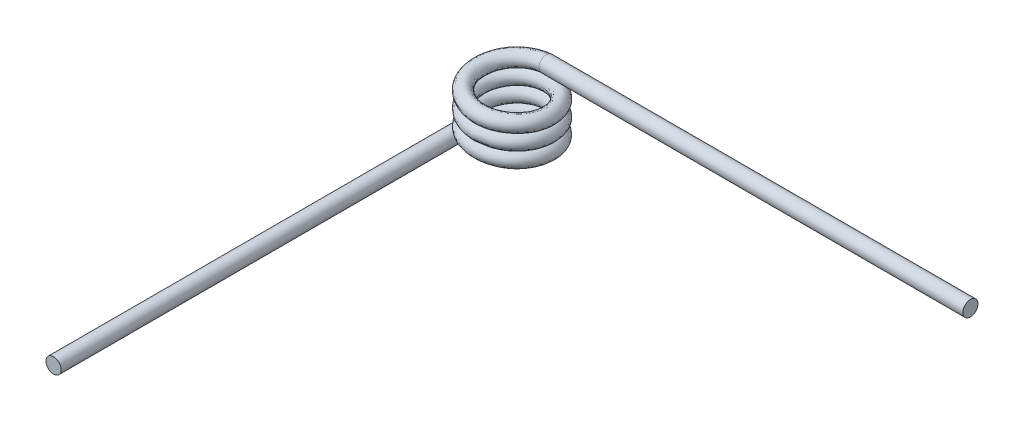
ISO-10303-21;
HEADER;
FILE_DESCRIPTION(('STEP AP214'),'2;1');
FILE_NAME('part.step','',(''),(''),'','','');
FILE_SCHEMA(('AUTOMOTIVE_DESIGN { 1 0 10303 214 1 1 1 1 }'));
ENDSEC;
DATA;
#1=APPLICATION_CONTEXT('core data for automotive mechanical design processes');
#2=APPLICATION_PROTOCOL_DEFINITION('international standard','automotive_design',2000,#1);
#3=PRODUCT_CONTEXT('',#1,'mechanical');
#4=PRODUCT('Part','Part','',(#3));
#5=PRODUCT_RELATED_PRODUCT_CATEGORY('part','',(#4));
#6=PRODUCT_DEFINITION_FORMATION('','',#4);
#7=PRODUCT_DEFINITION_CONTEXT('part definition',#1,'design');
#8=PRODUCT_DEFINITION('design','',#6,#7);
#9=PRODUCT_DEFINITION_SHAPE('','',#8);
#10=(LENGTH_UNIT() NAMED_UNIT(*) SI_UNIT(.MILLI.,.METRE.));
#11=(NAMED_UNIT(*) PLANE_ANGLE_UNIT() SI_UNIT($,.RADIAN.));
#12=(NAMED_UNIT(*) SI_UNIT($,.STERADIAN.) SOLID_ANGLE_UNIT());
#13=UNCERTAINTY_MEASURE_WITH_UNIT(LENGTH_MEASURE(1.E-05),#10,'distance_accuracy_value','');
#14=(GEOMETRIC_REPRESENTATION_CONTEXT(3) GLOBAL_UNCERTAINTY_ASSIGNED_CONTEXT((#13)) GLOBAL_UNIT_ASSIGNED_CONTEXT((#10,
#11,#12)) REPRESENTATION_CONTEXT('',''));
#15=CARTESIAN_POINT('',(0.,0.,0.));
#16=DIRECTION('',(0.,0.,1.));
#17=DIRECTION('',(1.,0.,0.));
#18=AXIS2_PLACEMENT_3D('',#15,#16,#17);
#19=CARTESIAN_POINT('',(50.,5.85,-4.09999999999983));
#20=DIRECTION('',(-1.,0.,0.));
#21=DIRECTION('',(0.,0.,1.));
#22=AXIS2_PLACEMENT_3D('',#19,#20,#21);
#23=PLANE('',#22);
#24=CARTESIAN_POINT('',(50.,5.85,-4.09999999999983));
#25=DIRECTION('',(-1.,0.,0.));
#26=DIRECTION('',(0.,0.,1.));
#27=AXIS2_PLACEMENT_3D('',#24,#25,#26);
#28=CIRCLE('',#27,0.895);
#29=CARTESIAN_POINT('',(50.,5.85,-3.20499999999983));
#30=VERTEX_POINT('',#29);
#31=EDGE_CURVE('E74',#30,#30,#28,.T.);
#32=ORIENTED_EDGE('',*,*,#31,.F.);
#33=EDGE_LOOP('',(#32));
#34=FACE_BOUND('',#33,.T.);
#35=ADVANCED_FACE('F59',(#34),#23,.F.);
#36=CARTESIAN_POINT('',(-4.09999999999998,0.,50.));
#37=DIRECTION('',(0.,0.,1.));
#38=DIRECTION('',(0.999999984999263,0.000173209334708053,0.));
#39=AXIS2_PLACEMENT_3D('',#36,#37,#38);
#40=PLANE('',#39);
#41=CARTESIAN_POINT('',(-4.09999999999998,0.,50.));
#42=DIRECTION('',(0.,0.,1.));
#43=DIRECTION('',(0.999999984999263,0.000173209334708053,0.));
#44=AXIS2_PLACEMENT_3D('',#41,#42,#43);
#45=CIRCLE('',#44,0.895);
#46=CARTESIAN_POINT('',(-3.20500001342564,0.00015502235456631,50.));
#47=VERTEX_POINT('',#46);
#48=EDGE_CURVE('E68',#47,#47,#45,.T.);
#49=ORIENTED_EDGE('',*,*,#48,.T.);
#50=EDGE_LOOP('',(#49));
#51=FACE_BOUND('',#50,.T.);
#52=ADVANCED_FACE('F150',(#51),#40,.T.);
#53=CARTESIAN_POINT('',(1.31838984174237E-13,5.85,-4.1));
#54=DIRECTION('',(1.,0.,0.));
#55=DIRECTION('',(0.,0.,-1.));
#56=AXIS2_PLACEMENT_3D('',#53,#54,#55);
#57=CYLINDRICAL_SURFACE('',#56,0.895);
#58=ORIENTED_EDGE('',*,*,#31,.T.);
#59=EDGE_LOOP('',(#58));
#60=FACE_BOUND('',#59,.T.);
#61=CARTESIAN_POINT('',(1.31838984174237E-13,5.85,-4.1));
#62=DIRECTION('',(-0.997567791117822,-0.0697029563527303,0.));
#63=DIRECTION('',(0.,0.,1.));
#64=AXIS2_PLACEMENT_3D('',#61,#62,#63);
#65=CIRCLE('',#64,0.895);
#66=CARTESIAN_POINT('',(1.12795573631392E-13,5.85,-3.205));
#67=VERTEX_POINT('',#66);
#68=EDGE_CURVE('E62',#67,#67,#65,.T.);
#69=ORIENTED_EDGE('',*,*,#68,.F.);
#70=EDGE_LOOP('',(#69));
#71=FACE_BOUND('',#70,.T.);
#72=ADVANCED_FACE('F112',(#60,#71),#57,.T.);
#73=CARTESIAN_POINT('',(-3.20500001342565,0.000154645307818939,1.08055164468879E-05));
#74=CARTESIAN_POINT('',(-3.2050013299972,0.0383816007414158,-0.429189029505993));
#75=CARTESIAN_POINT('',(-3.11621796892935,0.0771385992123076,-0.859326699102032));
#76=CARTESIAN_POINT('',(-2.45243955935918,0.228419514681997,-2.43070850785631));
#77=CARTESIAN_POINT('',(-1.18164623743942,0.344924435274742,-3.24288729839574));
#78=CARTESIAN_POINT('',(1.37560178644054,0.572610691536532,-3.16417848126939));
#79=CARTESIAN_POINT('',(2.59908753937639,0.689622922267981,-2.26746000231663));
#80=CARTESIAN_POINT('',(3.38450432639152,0.899813904964377,-0.0389316529655378));
#81=CARTESIAN_POINT('',(3.17319911975832,0.998664578495864,1.18478394792553));
#82=CARTESIAN_POINT('',(1.61077343776416,1.2193731730278,3.08927138594743));
#83=CARTESIAN_POINT('',(0.0336030657551545,1.34066765999369,3.48204795871798));
#84=CARTESIAN_POINT('',(-2.48737425252371,1.58467708717419,2.43935441755975));
#85=CARTESIAN_POINT('',(-3.322439560533,1.70707492561746,1.03900660883233));
#86=CARTESIAN_POINT('',(-3.06183280560357,1.94467420520004,-1.61465694780401));
#87=CARTESIAN_POINT('',(-2.04402537359597,2.06370448888653,-2.79072118364711));
#88=CARTESIAN_POINT('',(0.454572081571415,2.29289283740052,-3.41914635713131));
#89=CARTESIAN_POINT('',(1.88054140060302,2.41038565352774,-2.89060667753968));
#90=CARTESIAN_POINT('',(3.35125471925957,2.6368247590209,-0.812960447732239));
#91=CARTESIAN_POINT('',(3.37502074409755,2.75446140942662,0.708966098216149));
#92=CARTESIAN_POINT('',(1.96832642065917,2.9809954214511,2.83175997687712));
#93=CARTESIAN_POINT('',(0.560300389829423,3.09837870307389,3.4037317767149));
#94=CARTESIAN_POINT('',(-1.93173717038222,3.32531776364883,2.85783840746567));
#95=CARTESIAN_POINT('',(-2.97104302840074,3.44223051348647,1.75499005185013));
#96=CARTESIAN_POINT('',(-3.36311468203757,3.66969967839537,-0.771859289282536));
#97=CARTESIAN_POINT('',(-2.71219328746953,3.78609667668421,-2.1350278426114));
#98=CARTESIAN_POINT('',(-0.49269288598277,4.01407062177147,-3.41626071029161));
#99=CARTESIAN_POINT('',(1.00925609570965,4.13000516148698,-3.30176921345476));
#100=CARTESIAN_POINT('',(3.00943699413217,4.35839846983283,-1.69204754801851));
#101=CARTESIAN_POINT('',(3.44385294100598,4.47397850478147,-0.253189967894031));
#102=CARTESIAN_POINT('',(2.66448149747458,4.70265467495869,2.19647338701847));
#103=CARTESIAN_POINT('',(1.48063915010857,4.81805237315276,3.11975744358879));
#104=CARTESIAN_POINT('',(-1.0860007615064,5.04680580428563,3.27808286597758));
#105=CARTESIAN_POINT('',(-2.37453223483457,5.16225905365727,2.50687897809769));
#106=CARTESIAN_POINT('',(-3.44929881928071,5.39097281853296,0.171010940190842));
#107=CARTESIAN_POINT('',(-3.19026859059207,5.50673521976878,-1.31324440463397));
#108=CARTESIAN_POINT('',(-1.71006202555596,5.69621065459718,-2.8408914428862));
#109=CARTESIAN_POINT('',(-0.864108123636782,5.77303766190829,-3.20499855663933));
#110=CARTESIAN_POINT('',(1.07552855510562E-13,5.85,-3.205));
#111=CARTESIAN_POINT('',(-3.20508118294069,0.467635758530262,0.0326750674551346));
#112=CARTESIAN_POINT('',(-3.209385163449,0.50586145164813,-0.39652019976706));
#113=CARTESIAN_POINT('',(-3.12511629615128,0.544618732220028,-0.827609276396845));
#114=CARTESIAN_POINT('',(-2.47675118719805,0.69590068197791,-2.40552581988831));
#115=CARTESIAN_POINT('',(-1.21470696330118,0.812405499347613,-3.23116270038948));
#116=CARTESIAN_POINT('',(1.34335983245034,1.0400913620739,-3.17798224951149));
#117=CARTESIAN_POINT('',(2.57628559744716,1.15710365428988,-2.29407978511829));
#118=CARTESIAN_POINT('',(3.38391277510455,1.36729473519533,-0.0733468933562186));
#119=CARTESIAN_POINT('',(3.18522709353604,1.46614622707909,1.15238591074265));
#120=CARTESIAN_POINT('',(1.64240489399777,1.68685389120813,3.07299605480319));
#121=CARTESIAN_POINT('',(0.0690983362146306,1.80815018750543,3.48173995441145));
#122=CARTESIAN_POINT('',(-2.46256828416014,2.05215664156883,2.46479951116549));
#123=CARTESIAN_POINT('',(-3.31211080521433,2.17455648932132,1.07286434010239));
#124=CARTESIAN_POINT('',(-3.07814848353979,2.41215429136843,-1.58345036589963));
#125=CARTESIAN_POINT('',(-2.07257100089001,2.53118523066888,-2.77021266916508));
#126=CARTESIAN_POINT('',(0.41979803207613,2.76037367036715,-3.42353808980824));
#127=CARTESIAN_POINT('',(1.85134039132263,2.87786639604855,-2.90998180810748));
#128=CARTESIAN_POINT('',(3.34277111969176,3.10430559219509,-0.846960681285954));
#129=CARTESIAN_POINT('',(3.38253511677856,3.22194215126531,0.674735061786532));
#130=CARTESIAN_POINT('',(1.99697087948642,3.4484762553119,2.81157044612987));
#131=CARTESIAN_POINT('',(0.594939503367396,3.56585944402734,3.39835118225756));
#132=CARTESIAN_POINT('',(-1.90256864446002,3.79279859839674,2.8772776066313));
#133=CARTESIAN_POINT('',(-2.953483213921,3.90971125378712,1.78534203555492));
#134=CARTESIAN_POINT('',(-3.37073360333336,4.13718051379547,-0.737633894115676));
#135=CARTESIAN_POINT('',(-2.73413829878706,4.25357741683089,-2.10766498124113));
#136=CARTESIAN_POINT('',(-0.527373523544008,4.48155145732632,-3.41102610081762));
#137=CARTESIAN_POINT('',(0.975798940463027,4.59748590193276,-3.31232940981083));
#138=CARTESIAN_POINT('',(2.99204244235549,4.82587930508903,-1.7225137225697));
#139=CARTESIAN_POINT('',(3.44159843242577,4.94145924612306,-0.288207209889266));
#140=CARTESIAN_POINT('',(2.68662159118871,5.17013550929634,2.16925219418923));
#141=CARTESIAN_POINT('',(1.51247654556927,5.28553311389776,3.10500042821253));
#142=CARTESIAN_POINT('',(-1.05261914492358,5.51428664083588,3.28889821745873));
#143=CARTESIAN_POINT('',(-2.34928619730383,5.62973985803506,2.53124283296671));
#144=CARTESIAN_POINT('',(-3.44732865130242,5.85845353054291,0.206047830751971));
#145=CARTESIAN_POINT('',(-3.20380871589026,5.97421546035903,-1.28085890389312));
#146=CARTESIAN_POINT('',(-1.73890567232911,6.1636923833992,-2.82337217634719));
#147=CARTESIAN_POINT('',(-0.896926756789582,6.24050524928003,-3.19633600219198));
#148=CARTESIAN_POINT('',(-0.0326642624285667,6.31748112023501,-3.205));
#149=CARTESIAN_POINT('',(-3.63153412522373,0.892904131751271,0.0623898027550876));
#150=CARTESIAN_POINT('',(-3.63974965486505,0.931320754815126,-0.425729451743245));
#151=CARTESIAN_POINT('',(-3.54837528343568,0.969718996339793,-0.911664488432049));
#152=CARTESIAN_POINT('',(-2.82391099329299,1.12192048361994,-2.70887626750492));
#153=CARTESIAN_POINT('',(-1.4048586983605,1.23725561079709,-3.65200433027286));
#154=CARTESIAN_POINT('',(1.49993515739105,1.46583419222778,-3.61139906964164));
#155=CARTESIAN_POINT('',(2.90033466372411,1.58193433780461,-2.62272476417291));
#156=CARTESIAN_POINT('',(3.8344687862607,1.79300503787936,-0.107467631307042));
#157=CARTESIAN_POINT('',(3.61763713209895,1.8916342839015,1.28141877538018));
#158=CARTESIAN_POINT('',(1.88651556061936,2.11189824057867,3.46795773284622));
#159=CARTESIAN_POINT('',(0.105762792600349,2.23347364836279,3.9446805180003));
#160=CARTESIAN_POINT('',(-2.77030898463452,2.47735290409048,2.81273929447469));
#161=CARTESIAN_POINT('',(-3.74493578059228,2.59950639288652,1.24408983265405));
#162=CARTESIAN_POINT('',(-3.50014749856589,2.83775225198073,-1.77168215969839));
#163=CARTESIAN_POINT('',(-2.3733812161966,2.95600637144514,-3.12208763288304));
#164=CARTESIAN_POINT('',(0.451488872102087,3.18615240951107,-3.88311913823876));
#165=CARTESIAN_POINT('',(2.07325677949654,3.30269824906851,-3.31455899017708));
#166=CARTESIAN_POINT('',(3.78258592764624,3.5300835540239,-0.98364853041262));
#167=CARTESIAN_POINT('',(3.83999202393256,3.64677383926392,0.73546201115712));
#168=CARTESIAN_POINT('',(2.28326505746291,3.87425442864057,3.17237671454517));
#169=CARTESIAN_POINT('',(0.703867173014298,3.99069032054049,3.8469033252635));
#170=CARTESIAN_POINT('',(-2.13589700012175,4.2185776013483,3.27452707626169));
#171=CARTESIAN_POINT('',(-3.33231028753508,4.3345410456852,2.0493457227285));
#172=CARTESIAN_POINT('',(-3.82553123188503,4.56296059480471,-0.81209664798876));
#173=CARTESIAN_POINT('',(-3.1174812327495,4.67840616156725,-2.36532829997638));
#174=CARTESIAN_POINT('',(-0.621909926501579,4.90733259306863,-3.8622261226911));
#175=CARTESIAN_POINT('',(1.07732087697,5.02231375463375,-3.76304623356736));
#176=CARTESIAN_POINT('',(3.37888725535226,5.25166133721885,-1.9734761753806));
#177=CARTESIAN_POINT('',(3.89860147231572,5.36628646203412,-0.356573558952148));
#178=CARTESIAN_POINT('',(3.06033550703156,5.59591815175093,2.43952266599124));
#179=CARTESIAN_POINT('',(1.74137954770347,5.71036037475177,3.50643126480831));
#180=CARTESIAN_POINT('',(-1.16968758528683,5.94006937777568,3.73502193920987));
#181=CARTESIAN_POINT('',(-2.6409716675378,6.05455841462305,2.88961626577972));
#182=CARTESIAN_POINT('',(-3.90566514830589,6.28423921779579,0.2579579394151));
#183=CARTESIAN_POINT('',(-3.64239277248086,6.39918772804201,-1.42419709232077));
#184=CARTESIAN_POINT('',(-1.99163387395414,6.58926638210995,-3.18641868227861));
#185=CARTESIAN_POINT('',(-1.04232496750708,6.66569567712396,-3.61488719065627));
#186=CARTESIAN_POINT('',(-0.0623841459355748,6.74282317305046,-3.63137909583952));
#187=CARTESIAN_POINT('',(-4.56877591948537,0.892742187563623,0.0623784872447741));
#188=CARTESIAN_POINT('',(-4.57698645864984,0.931588191410899,-0.555276356532607));
#189=CARTESIAN_POINT('',(-4.46096199558103,0.969189484900535,-1.15986462767263));
#190=CARTESIAN_POINT('',(-3.53839429611191,1.12341017767838,-3.42604901006823));
#191=CARTESIAN_POINT('',(-1.75671776622997,1.23617436612145,-4.60052319798879));
#192=CARTESIAN_POINT('',(1.9085938668991,1.46671605714304,-4.53650325898639));
#193=CARTESIAN_POINT('',(3.65824441769773,1.58081105187784,-3.29189353770318));
#194=CARTESIAN_POINT('',(4.82603799070356,1.7938150834018,-0.113639378469413));
#195=CARTESIAN_POINT('',(4.54407986150676,1.89195416474994,1.62984741185049));
#196=CARTESIAN_POINT('',(2.35984256272712,2.11124465023328,4.36869025715536));
#197=CARTESIAN_POINT('',(0.115365934031153,2.23342996604051,4.96290563361561));
#198=CARTESIAN_POINT('',(-3.49637868729715,2.47703556800432,3.52667016645441));
#199=CARTESIAN_POINT('',(-4.7170040582404,2.59864350620321,1.55275232071589));
#200=CARTESIAN_POINT('',(-4.39512991131327,2.83831684179556,-2.24785553953706));
#201=CARTESIAN_POINT('',(-2.97751353685964,2.95486208971451,-3.93657580645617));
#202=CARTESIAN_POINT('',(0.590697938318274,3.18711288260974,-4.88456008844739));
#203=CARTESIAN_POINT('',(2.61946253649889,3.30157751288672,-4.16512683455915));
#204=CARTESIAN_POINT('',(4.7663285385226,3.53104231806558,-1.21610736847518));
#205=CARTESIAN_POINT('',(4.8305185299199,3.64565274170817,0.937410543351328));
#206=CARTESIAN_POINT('',(2.85529140338397,3.87521365621359,4.0058591968373));
#207=CARTESIAN_POINT('',(0.874027434042758,3.9895674409825,4.843645829254));
#208=CARTESIAN_POINT('',(-2.70712291569776,4.2195386507885,4.10885943076595));
#209=CARTESIAN_POINT('',(-4.20014562648092,4.33341578330097,2.56895935434275));
#210=CARTESIAN_POINT('',(-4.810003168602,4.56392401265826,-1.04422714676765));
#211=CARTESIAN_POINT('',(-3.91623342250622,4.67727859768189,-2.98643459143352));
#212=CARTESIAN_POINT('',(-0.760353091425209,4.90829832906471,-4.86449707052414));
#213=CARTESIAN_POINT('',(1.36739482234989,5.02118422933347,-4.73266543165534));
#214=CARTESIAN_POINT('',(4.26401619877042,5.25262904419554,-2.46419494001424));
#215=CARTESIAN_POINT('',(4.90766807612492,5.36515553518513,-0.436818019818215));
#216=CARTESIAN_POINT('',(3.83753158262272,5.59688720214761,3.08805793332902));
#217=CARTESIAN_POINT('',(2.18086606497502,5.70922954789484,4.41834728683702));
#218=CARTESIAN_POINT('',(-1.49378387678572,5.94103863143122,4.69403453651333));
#219=CARTESIAN_POINT('',(-3.33262983224151,6.05340832728146,3.62864425867248));
#220=CARTESIAN_POINT('',(-4.91709419902607,6.28521520574521,0.301989949552291));
#221=CARTESIAN_POINT('',(-4.57938256731222,6.39837664709376,-1.80404578928289));
#222=CARTESIAN_POINT('',(-2.4894790608199,6.58977501499452,-4.01948499637931));
#223=CARTESIAN_POINT('',(-1.29626757767904,6.66521801984137,-4.55221725522382));
#224=CARTESIAN_POINT('',(-0.062384145935547,6.74282317305046,-4.56862090416048));
#225=CARTESIAN_POINT('',(-4.99508115608937,0.467326467914628,0.032653456422331));
#226=CARTESIAN_POINT('',(-4.99937866541127,0.506371207474231,-0.643944765590347));
#227=CARTESIAN_POINT('',(-4.86802853100669,0.543607439864323,-1.30163662483337));
#228=CARTESIAN_POINT('',(-3.84131377999974,0.698745788054834,-3.7752248642398));
#229=CARTESIAN_POINT('',(-1.88670828237957,0.81034047413361,-5.04270029734298));
#230=CARTESIAN_POINT('',(2.12384047632025,1.04177559999489,-4.94480110482388));
#231=CARTESIAN_POINT('',(4.0237866025986,1.15495833619669,-3.57209800196496));
#232=CARTESIAN_POINT('',(5.27767045876032,1.3688418081838,-0.0851340621722645));
#233=CARTESIAN_POINT('',(4.95460237205652,1.4667571544972,1.81783558845582));
#234=CARTESIAN_POINT('',(2.54639287901098,1.68560562559823,4.79326845856635));
#235=CARTESIAN_POINT('',(0.0874389853363724,1.80806676041514,5.42640667837828));
#236=CARTESIAN_POINT('',(-3.84925927064302,2.05155057428811,3.82830703878234));
#237=CARTESIAN_POINT('',(-5.1686244621413,2.17290849714882,1.6623662687697));
#238=CARTESIAN_POINT('',(-4.78743898316778,2.41323257848738,-2.49287453194305));
#239=CARTESIAN_POINT('',(-3.22637874226628,2.52899981354516,-4.32577049613065));
#240=CARTESIAN_POINT('',(0.68566776420945,2.76220803886259,-5.33614941909542));
#241=CARTESIAN_POINT('',(2.89451654540263,2.87572594760745,-4.53444673052197));
#242=CARTESIAN_POINT('',(5.22158111069105,3.1061366966353,-1.2909243590092));
#243=CARTESIAN_POINT('',(5.2743013930762,3.21980101265223,1.06042834756264));
#244=CARTESIAN_POINT('',(3.0894607258715,3.4503082450303,4.40340473058766));
#245=CARTESIAN_POINT('',(0.919921663301398,3.56371490204669,5.30198914025674));
#246=CARTESIAN_POINT('',(-2.99352978150156,3.79463406761915,4.47073502744094));
#247=CARTESIAN_POINT('',(-4.61092662171718,3.9075621609408,2.77773097118621));
#248=CARTESIAN_POINT('',(-5.25093650409898,4.13902050635695,-1.18097048999149));
#249=CARTESIAN_POINT('',(-4.25964261044663,4.25142392843903,-3.29389061889319));
#250=CARTESIAN_POINT('',(-0.791780491966143,4.48339587721608,-5.32522260879644));
#251=CARTESIAN_POINT('',(1.52979936770532,4.59532866751471,-5.16416566932699));
#252=CARTESIAN_POINT('',(4.68251420177023,4.8277274892741,-2.65971752727625));
#253=CARTESIAN_POINT('',(5.36877368728897,4.93929933494165,-0.441462841108176));
#254=CARTESIAN_POINT('',(4.17095675737121,5.17198625922709,3.40786331697198));
#255=CARTESIAN_POINT('',(2.35183396531087,5.28337339368804,4.8466317392986));
#256=CARTESIAN_POINT('',(-1.6715974668707,5.51613777896152,5.1204773616384));
#257=CARTESIAN_POINT('',(-3.67025598741383,5.62754335301039,3.94268233077771));
#258=CARTESIAN_POINT('',(-5.37901584740831,5.86031753022135,0.290142775578263));
#259=CARTESIAN_POINT('',(-4.99332740558665,5.97266640985421,-2.00631647687337));
#260=CARTESIAN_POINT('',(-2.68971994093443,6.16466380065204,-4.41441163809829));
#261=CARTESIAN_POINT('',(-1.38191218006724,6.23961801341894,-4.98642717809151));
#262=CARTESIAN_POINT('',(-0.0326642624285112,6.31748112023501,-4.995));
#263=CARTESIAN_POINT('',(-4.99491881705929,-0.467635758530259,-0.0326750674550444));
#264=CARTESIAN_POINT('',(-4.99061818870413,-0.428588029900683,-0.709301595140946));
#265=CARTESIAN_POINT('',(-4.85023187656284,-0.391352826151118,-1.36507147024374));
#266=CARTESIAN_POINT('',(-3.79269052432201,-0.236216546536992,-3.8255902401758));
#267=CARTESIAN_POINT('',(-1.82058683065605,-0.124621654012134,-5.06614949335656));
#268=CARTESIAN_POINT('',(2.18832438430066,0.106814258920156,-4.91719356833861));
#269=CARTESIAN_POINT('',(4.06939048645705,0.219996872152886,-3.51885843636164));
#270=CARTESIAN_POINT('',(5.27885356133425,0.433880147721906,-0.0163035813909029));
#271=CARTESIAN_POINT('',(4.93054642450108,0.531793857330738,1.88263166282158));
#272=CARTESIAN_POINT('',(2.48312996654375,0.750644189237549,4.82581912085481));
#273=CARTESIAN_POINT('',(0.0164484444174209,0.873101705391664,5.42702268699133));
#274=CARTESIAN_POINT('',(-3.89887120737017,1.11659146549883,3.77741685157086));
#275=CARTESIAN_POINT('',(-5.18928197277865,1.2379453697411,1.59465080622957));
#276=CARTESIAN_POINT('',(-4.75480762729534,1.47827240615058,-2.5552876957518));
#277=CARTESIAN_POINT('',(-3.1692874876782,1.59403832998046,-4.36678752509325));
#278=CARTESIAN_POINT('',(0.75521586320002,1.82724637292932,-5.32736595374299));
#279=CARTESIAN_POINT('',(2.95291856395772,1.94076446256582,-4.49569646938638));
#280=CARTESIAN_POINT('',(5.23854830983234,2.17117503028693,-1.22292389190177));
#281=CARTESIAN_POINT('',(5.2592726477142,2.28483952897483,1.12889042042187));
#282=CARTESIAN_POINT('',(3.03217180821699,2.51534657730869,4.44378379208217));
#283=CARTESIAN_POINT('',(0.850643436225454,2.6287534201398,5.31275032917141));
#284=CARTESIAN_POINT('',(-3.05186683334595,2.85967239812334,4.43185662910969));
#285=CARTESIAN_POINT('',(-4.64604625067667,2.9726006803395,2.71702700377664));
#286=CARTESIAN_POINT('',(-5.2356986615074,3.20405883555674,-1.24942128032521));
#287=CARTESIAN_POINT('',(-4.21575258781157,3.31646244814567,-3.34861634163372));
#288=CARTESIAN_POINT('',(-0.722419216843666,3.54843420610639,-5.33569182774441));
#289=CARTESIAN_POINT('',(1.59671367819288,3.66036718662315,-5.14304527661485));
#290=CARTESIAN_POINT('',(4.71730330532929,3.8927658187617,-2.59878517817387));
#291=CARTESIAN_POINT('',(5.37328270444939,4.00433785225846,-0.371428357117707));
#292=CARTESIAN_POINT('',(4.12667656994295,4.23702459055178,3.46230570263046));
#293=CARTESIAN_POINT('',(2.28815917438947,4.34841191219803,4.87614577005183));
#294=CARTESIAN_POINT('',(-1.73836070003634,4.58117610586104,5.09884665867539));
#295=CARTESIAN_POINT('',(-3.7207480624753,4.69258174425479,3.89395462103967));
#296=CARTESIAN_POINT('',(-5.38295618336489,4.92535610620145,0.220068994456006));
#297=CARTESIAN_POINT('',(-4.96624715499028,5.0377059286737,-2.07108747835508));
#298=CARTESIAN_POINT('',(-2.63203264738812,5.22970034304801,-4.44945017117631));
#299=CARTESIAN_POINT('',(-1.31624491432121,5.30467559237939,-5.00357076513241));
#300=CARTESIAN_POINT('',(0.0326642624288373,5.382518879765,-4.995));
#301=CARTESIAN_POINT('',(-4.56846587477624,-0.892904131751268,-0.0623898027549974));
#302=CARTESIAN_POINT('',(-4.56025290188742,-0.854052408943415,-0.680092627905203));
#303=CARTESIAN_POINT('',(-4.42697288927703,-0.816453090270881,-1.28101625820854));
#304=CARTESIAN_POINT('',(-3.44553071823136,-0.662236348179018,-3.52223979255918));
#305=CARTESIAN_POINT('',(-1.63043509559674,-0.54947176546019,-4.64530786347248));
#306=CARTESIAN_POINT('',(2.03174905935995,-0.318928571235145,-4.48377674820917));
#307=CARTESIAN_POINT('',(3.74534142018295,-0.204833811360422,-3.19021345730703));
#308=CARTESIAN_POINT('',(4.82829755017568,0.00816984503666103,0.0178171565599202));
#309=CARTESIAN_POINT('',(4.49813638594061,0.106305800507112,1.75359879818893));
#310=CARTESIAN_POINT('',(2.23901929991913,0.325599839868524,4.43085744280572));
#311=CARTESIAN_POINT('',(-0.0202160119622328,0.447778244535822,4.96408212340551));
#312=CARTESIAN_POINT('',(-3.59113050690186,0.691395202975668,3.42947706825863));
#313=CARTESIAN_POINT('',(-4.75645699739994,0.812995466174387,1.42342531367184));
#314=CARTESIAN_POINT('',(-4.33280861226997,1.05267444553974,-2.36705590194723));
#315=CARTESIAN_POINT('',(-2.8684772723658,1.16921718919984,-4.0149125613782));
#316=CARTESIAN_POINT('',(0.723525023168363,1.40146763378968,-4.86778490530963));
#317=CARTESIAN_POINT('',(2.73100217578382,1.51593260954728,-4.09111928729973));
#318=CARTESIAN_POINT('',(4.79873350187787,1.7453970684567,-1.08623604279215));
#319=CARTESIAN_POINT('',(4.80181574056019,1.86000784097764,1.06816347106263));
#320=CARTESIAN_POINT('',(2.7458776302405,2.0895684039786,4.08297752365552));
#321=CARTESIAN_POINT('',(0.741715766589917,2.20392254362806,4.86419818616476));
#322=CARTESIAN_POINT('',(-2.81853847769558,2.43389339517036,4.03460715948));
#323=CARTESIAN_POINT('',(-4.26721917706401,2.54777088844427,2.45302331660306));
#324=CARTESIAN_POINT('',(-4.7809010329543,2.77827875454466,-1.17495852645213));
#325=CARTESIAN_POINT('',(-3.83240965384912,2.89163370341358,-3.09095302289848));
#326=CARTESIAN_POINT('',(-0.627882813886096,3.1226530703598,-4.88449180587094));
#327=CARTESIAN_POINT('',(1.49519174169159,3.23553933392074,-4.69232845285547));
#328=CARTESIAN_POINT('',(4.33045849232682,3.4669837866333,-2.34782272536582));
#329=CARTESIAN_POINT('',(4.91627966455944,3.57951063634883,-0.30306200806622));
#330=CARTESIAN_POINT('',(3.75296265410009,3.81124194809577,3.19203523083987));
#331=CARTESIAN_POINT('',(2.05925617225527,3.92358465134117,4.47471493345676));
#332=CARTESIAN_POINT('',(-1.62129225967308,4.15539336892408,4.65272293692353));
#333=CARTESIAN_POINT('',(-3.42906259224134,4.26776318766823,3.53558118822096));
#334=CARTESIAN_POINT('',(-4.92461968636143,4.49957041894714,0.168158885798585));
#335=CARTESIAN_POINT('',(-4.52766309840252,4.61273366098646,-1.92774928992742));
#336=CARTESIAN_POINT('',(-2.37930444576122,4.80412634434009,-4.08640366524487));
#337=CARTESIAN_POINT('',(-1.17086184639572,4.87961206310345,-4.58501660643573));
#338=CARTESIAN_POINT('',(0.0623841459358385,4.95717682694955,-4.56862090416048));
#339=CARTESIAN_POINT('',(-3.63122408051461,-0.892742187563619,-0.0623784872446839));
#340=CARTESIAN_POINT('',(-3.62300916923862,-0.854320198815289,-0.550527247887731));
#341=CARTESIAN_POINT('',(-3.51438617713167,-0.815923578831623,-1.03281611896796));
#342=CARTESIAN_POINT('',(-2.73104741541244,-0.663726042237458,-2.80506704999588));
#343=CARTESIAN_POINT('',(-1.27857602772726,-0.548390520784541,-3.69678899575655));
#344=CARTESIAN_POINT('',(1.6230903498519,-0.319810436150405,-3.55867255886441));
#345=CARTESIAN_POINT('',(2.98743166620933,-0.203710525433655,-2.52104468377675));
#346=CARTESIAN_POINT('',(3.83672834573282,0.00735979951421473,0.0239889037222921));
#347=CARTESIAN_POINT('',(3.5716936565328,0.105985919658673,1.40517016171862));
#348=CARTESIAN_POINT('',(1.76569229781138,0.326253430213917,3.53012491849657));
#349=CARTESIAN_POINT('',(-0.0298191533930367,0.447821926858102,3.94585700779021));
#350=CARTESIAN_POINT('',(-2.86506080423923,0.691712539061833,2.71554619627891));
#351=CARTESIAN_POINT('',(-3.78438871975182,0.813858352857695,1.11476282561001));
#352=CARTESIAN_POINT('',(-3.43782619952259,1.05210985572491,-1.89088252210856));
#353=CARTESIAN_POINT('',(-2.26434495170276,1.17036147093046,-3.20042438780798));
#354=CARTESIAN_POINT('',(0.584315956952176,1.400507160691,-3.86634395509815));
#355=CARTESIAN_POINT('',(2.18479641878147,1.51705334572907,-3.24055144291767));
#356=CARTESIAN_POINT('',(3.8149908910015,1.74443830441502,-0.853777204729585));
#357=CARTESIAN_POINT('',(3.81128923457569,1.8611289385334,0.866214938868427));
#358=CARTESIAN_POINT('',(2.17385128431661,2.08860917640559,3.24949504136339));
#359=CARTESIAN_POINT('',(0.571555505561457,2.20504542318605,3.86745568217425));
#360=CARTESIAN_POINT('',(-2.24731256211957,2.43293234573015,3.20027480497574));
#361=CARTESIAN_POINT('',(-3.39938383811817,2.5488961508285,1.93340968498881));
#362=CARTESIAN_POINT('',(-3.79642909623733,2.7773153366911,-0.942828027673239));
#363=CARTESIAN_POINT('',(-3.03365746409809,2.89276126729894,-2.46984673144134));
#364=CARTESIAN_POINT('',(-0.489439648956765,3.12168733436373,-3.88222085803789));
#365=CARTESIAN_POINT('',(1.2051177963174,3.23666885922102,-3.72270925476749));
#366=CARTESIAN_POINT('',(3.44532954890296,3.4660160796566,-1.85710396073218));
#367=CARTESIAN_POINT('',(3.90721306075024,3.58064156319782,-0.222817547200154));
#368=CARTESIAN_POINT('',(2.97576657850893,3.81027289769909,2.54349996350208));
#369=CARTESIAN_POINT('',(1.61976965498372,3.9247154781981,3.56279891142733));
#370=CARTESIAN_POINT('',(-1.29719596817419,4.15442411526854,3.69371033962078));
#371=CARTESIAN_POINT('',(-2.73740442753763,4.26891327500982,2.7965531953282));
#372=CARTESIAN_POINT('',(-3.91319063564124,4.49859443099772,0.124126875661392));
#373=CARTESIAN_POINT('',(-3.59067330356549,4.6135447419347,-1.54790059297097));
#374=CARTESIAN_POINT('',(-1.88145925889923,4.80361771145552,-3.25333735114041));
#375=CARTESIAN_POINT('',(-0.916948145755179,4.88009684736118,-3.64786145699056));
#376=CARTESIAN_POINT('',(0.0623841459358107,4.95717682694955,-3.63137909583952));
#377=CARTESIAN_POINT('',(-3.20491884391061,-0.467326467914624,-0.0326534564222408));
#378=CARTESIAN_POINT('',(-3.20061749654541,-0.429098250165299,-0.461857859244925));
#379=CARTESIAN_POINT('',(-3.10731964170742,-0.390341533795413,-0.891044121807219));
#380=CARTESIAN_POINT('',(-2.42812793152032,-0.239061652613916,-2.45589119582431));
#381=CARTESIAN_POINT('',(-1.14858551157766,-0.12255662879813,-3.254611896402));
#382=CARTESIAN_POINT('',(1.40784374043075,0.105130020999167,-3.15037471302729));
#383=CARTESIAN_POINT('',(2.62188948130561,0.222142190246079,-2.24084021951498));
#384=CARTESIAN_POINT('',(3.38509587767848,0.432333074733427,-0.00451641257485707));
#385=CARTESIAN_POINT('',(3.1611711459806,0.531182929912633,1.21718198510841));
#386=CARTESIAN_POINT('',(1.57914198153055,0.751892454847457,3.10554671709166));
#387=CARTESIAN_POINT('',(-0.00189220470432172,0.873185132481959,3.48235596302451));
#388=CARTESIAN_POINT('',(-2.51218022088729,1.11719753277955,2.41390932395402));
#389=CARTESIAN_POINT('',(-3.33276831585167,1.2395933619136,1.00514887756226));
#390=CARTESIAN_POINT('',(-3.04551712766735,1.47719411903164,-1.64586352970839));
#391=CARTESIAN_POINT('',(-2.01547974630193,1.59622374710418,-2.81122969812913));
#392=CARTESIAN_POINT('',(0.4893461310667,1.82541200443388,-3.41475462445438));
#393=CARTESIAN_POINT('',(1.9097424098834,1.94290491100692,-2.87123154697189));
#394=CARTESIAN_POINT('',(3.35973831882737,2.16934392584672,-0.778960214178523));
#395=CARTESIAN_POINT('',(3.36750637141655,2.28698066758792,0.743197134645765));
#396=CARTESIAN_POINT('',(1.93968196183192,2.5135145875903,2.85194950762438));
#397=CARTESIAN_POINT('',(0.525661276291451,2.63089796212044,3.40911237117223));
#398=CARTESIAN_POINT('',(-1.96090569630441,2.85783692890093,2.83839920830004));
#399=CARTESIAN_POINT('',(-2.98860284288048,2.97474977318582,1.72463806814535));
#400=CARTESIAN_POINT('',(-3.35549576074178,3.20221884299526,-0.806084684449395));
#401=CARTESIAN_POINT('',(-2.690248276152,3.31861593653754,-2.16239070398166));
#402=CARTESIAN_POINT('',(-0.458012248421532,3.54658978621663,-3.42149531976559));
#403=CARTESIAN_POINT('',(1.04271325095628,3.6625244210412,-3.29120901709869));
#404=CARTESIAN_POINT('',(3.02683154590886,3.89091763457663,-1.66158137346732));
#405=CARTESIAN_POINT('',(3.44610744958619,4.00649776343987,-0.218172725898796));
#406=CARTESIAN_POINT('',(2.64234140376045,4.23517384062104,2.22369457984771));
#407=CARTESIAN_POINT('',(1.44880175464787,4.35057163240776,3.13451445896505));
#408=CARTESIAN_POINT('',(-1.11938237808922,4.57932496773539,3.26726751449643));
#409=CARTESIAN_POINT('',(-2.3997782723653,4.69477824927947,2.48251512322867));
#410=CARTESIAN_POINT('',(-3.451268987259,4.92349210652301,0.135974049629713));
#411=CARTESIAN_POINT('',(-3.17672846529389,5.03925497917852,-1.34562990537483));
#412=CARTESIAN_POINT('',(-1.6812183787828,5.22872892579517,-2.85841070942521));
#413=CARTESIAN_POINT('',(-0.831289490483982,5.30557007453656,-3.21366111108668));
#414=CARTESIAN_POINT('',(0.0326642624287818,5.382518879765,-3.205));
#415=CARTESIAN_POINT('',(-3.20500001342565,0.000154645307818939,1.08055164468879E-05));
#416=CARTESIAN_POINT('',(-3.2050013299972,0.0383816007414158,-0.429189029505993));
#417=CARTESIAN_POINT('',(-3.11621796892935,0.0771385992123076,-0.859326699102032));
#418=CARTESIAN_POINT('',(-2.45243955935918,0.228419514681997,-2.43070850785631));
#419=CARTESIAN_POINT('',(-1.18164623743942,0.344924435274742,-3.24288729839574));
#420=CARTESIAN_POINT('',(1.37560178644054,0.572610691536532,-3.16417848126939));
#421=CARTESIAN_POINT('',(2.59908753937639,0.689622922267981,-2.26746000231663));
#422=CARTESIAN_POINT('',(3.38450432639152,0.899813904964377,-0.0389316529655378));
#423=CARTESIAN_POINT('',(3.17319911975832,0.998664578495864,1.18478394792553));
#424=CARTESIAN_POINT('',(1.61077343776416,1.2193731730278,3.08927138594743));
#425=CARTESIAN_POINT('',(0.0336030657551545,1.34066765999369,3.48204795871798));
#426=CARTESIAN_POINT('',(-2.48737425252371,1.58467708717419,2.43935441755975));
#427=CARTESIAN_POINT('',(-3.322439560533,1.70707492561746,1.03900660883233));
#428=CARTESIAN_POINT('',(-3.06183280560357,1.94467420520004,-1.61465694780401));
#429=CARTESIAN_POINT('',(-2.04402537359597,2.06370448888653,-2.79072118364711));
#430=CARTESIAN_POINT('',(0.454572081571415,2.29289283740052,-3.41914635713131));
#431=CARTESIAN_POINT('',(1.88054140060302,2.41038565352774,-2.89060667753968));
#432=CARTESIAN_POINT('',(3.35125471925957,2.6368247590209,-0.812960447732239));
#433=CARTESIAN_POINT('',(3.37502074409755,2.75446140942662,0.708966098216149));
#434=CARTESIAN_POINT('',(1.96832642065917,2.9809954214511,2.83175997687712));
#435=CARTESIAN_POINT('',(0.560300389829423,3.09837870307389,3.4037317767149));
#436=CARTESIAN_POINT('',(-1.93173717038222,3.32531776364883,2.85783840746567));
#437=CARTESIAN_POINT('',(-2.97104302840074,3.44223051348647,1.75499005185013));
#438=CARTESIAN_POINT('',(-3.36311468203757,3.66969967839537,-0.771859289282536));
#439=CARTESIAN_POINT('',(-2.71219328746953,3.78609667668421,-2.1350278426114));
#440=CARTESIAN_POINT('',(-0.49269288598277,4.01407062177147,-3.41626071029161));
#441=CARTESIAN_POINT('',(1.00925609570965,4.13000516148698,-3.30176921345476));
#442=CARTESIAN_POINT('',(3.00943699413217,4.35839846983283,-1.69204754801851));
#443=CARTESIAN_POINT('',(3.44385294100598,4.47397850478147,-0.253189967894031));
#444=CARTESIAN_POINT('',(2.66448149747458,4.70265467495869,2.19647338701847));
#445=CARTESIAN_POINT('',(1.48063915010857,4.81805237315276,3.11975744358879));
#446=CARTESIAN_POINT('',(-1.0860007615064,5.04680580428563,3.27808286597758));
#447=CARTESIAN_POINT('',(-2.37453223483457,5.16225905365727,2.50687897809769));
#448=CARTESIAN_POINT('',(-3.44929881928071,5.39097281853296,0.171010940190842));
#449=CARTESIAN_POINT('',(-3.19026859059207,5.50673521976878,-1.31324440463397));
#450=CARTESIAN_POINT('',(-1.71006202555596,5.69621065459718,-2.8408914428862));
#451=CARTESIAN_POINT('',(-0.864108123636782,5.77303766190829,-3.20499855663933));
#452=CARTESIAN_POINT('',(1.07552855510562E-13,5.85,-3.205));
#453=B_SPLINE_SURFACE_WITH_KNOTS('',3,3,((#73,#74,#75,#76,#77,#78,#79,#80,#81,#82,#83,#84,#85,
#86,#87,#88,#89,#90,#91,#92,#93,#94,#95,#96,#97,#98,#99,#100,#101,#102,#103,#104,#105,#106,#107,
#108,#109,#110),(#111,#112,#113,#114,#115,#116,#117,#118,#119,#120,#121,#122,#123,#124,#125,
#126,#127,#128,#129,#130,#131,#132,#133,#134,#135,#136,#137,#138,#139,#140,#141,#142,#143,#144,
#145,#146,#147,#148),(#149,#150,#151,#152,#153,#154,#155,#156,#157,#158,#159,#160,#161,#162,
#163,#164,#165,#166,#167,#168,#169,#170,#171,#172,#173,#174,#175,#176,#177,#178,#179,#180,#181,
#182,#183,#184,#185,#186),(#187,#188,#189,#190,#191,#192,#193,#194,#195,#196,#197,#198,#199,
#200,#201,#202,#203,#204,#205,#206,#207,#208,#209,#210,#211,#212,#213,#214,#215,#216,#217,#218,
#219,#220,#221,#222,#223,#224),(#225,#226,#227,#228,#229,#230,#231,#232,#233,#234,#235,#236,
#237,#238,#239,#240,#241,#242,#243,#244,#245,#246,#247,#248,#249,#250,#251,#252,#253,#254,#255,
#256,#257,#258,#259,#260,#261,#262),(#263,#264,#265,#266,#267,#268,#269,#270,#271,#272,#273,
#274,#275,#276,#277,#278,#279,#280,#281,#282,#283,#284,#285,#286,#287,#288,#289,#290,#291,#292,
#293,#294,#295,#296,#297,#298,#299,#300),(#301,#302,#303,#304,#305,#306,#307,#308,#309,#310,
#311,#312,#313,#314,#315,#316,#317,#318,#319,#320,#321,#322,#323,#324,#325,#326,#327,#328,#329,
#330,#331,#332,#333,#334,#335,#336,#337,#338),(#339,#340,#341,#342,#343,#344,#345,#346,#347,
#348,#349,#350,#351,#352,#353,#354,#355,#356,#357,#358,#359,#360,#361,#362,#363,#364,#365,#366,
#367,#368,#369,#370,#371,#372,#373,#374,#375,#376),(#377,#378,#379,#380,#381,#382,#383,#384,
#385,#386,#387,#388,#389,#390,#391,#392,#393,#394,#395,#396,#397,#398,#399,#400,#401,#402,#403,
#404,#405,#406,#407,#408,#409,#410,#411,#412,#413,#414),(#415,#416,#417,#418,#419,#420,#421,
#422,#423,#424,#425,#426,#427,#428,#429,#430,#431,#432,#433,#434,#435,#436,#437,#438,#439,#440,
#441,#442,#443,#444,#445,#446,#447,#448,#449,#450,#451,#452)),.UNSPECIFIED.,.T.,.F.,.F.,(4,2,2,
2,4),(4,2,2,2,2,2,2,2,2,2,2,2,2,2,2,2,2,2,4),(0.,0.25,0.5,0.75,1.),(0.,0.0195010392474706,
0.0784740499888805,0.137291933217268,0.1875,0.25,0.3125,0.372545765020526,0.431356824726651,
0.490166296944194,0.54897995832147,0.607800052291475,0.666625753063569,0.725457984213477,
0.784297269691342,0.843140641936414,0.9019829962548,0.960888853611566,1.),.UNSPECIFIED.);
#454=CARTESIAN_POINT('',(-4.09999999999999,0.,0.));
#455=DIRECTION('',(0.,0.,1.));
#456=DIRECTION('',(0.999999984999263,0.000173209334708053,0.));
#457=AXIS2_PLACEMENT_3D('',#454,#455,#456);
#458=CIRCLE('',#457,0.895);
#459=CARTESIAN_POINT('',(-3.20500001341749,0.000154786756759906,5.40183474597746E-06));
#460=VERTEX_POINT('',#459);
#461=EDGE_CURVE('E12',#460,#460,#458,.T.);
#462=ORIENTED_EDGE('',*,*,#68,.T.);
#463=EDGE_LOOP('',(#462));
#464=FACE_BOUND('',#463,.T.);
#465=ORIENTED_EDGE('',*,*,#461,.F.);
#466=EDGE_LOOP('',(#465));
#467=FACE_BOUND('',#466,.T.);
#468=ADVANCED_FACE('F106',(#464,#467),#453,.F.);
#469=CARTESIAN_POINT('',(-4.09999999999998,0.,50.));
#470=DIRECTION('',(0.,0.,-1.));
#471=DIRECTION('',(-1.,0.,0.));
#472=AXIS2_PLACEMENT_3D('',#469,#470,#471);
#473=CYLINDRICAL_SURFACE('',#472,0.895);
#474=ORIENTED_EDGE('',*,*,#461,.T.);
#475=EDGE_LOOP('',(#474));
#476=FACE_BOUND('',#475,.T.);
#477=ORIENTED_EDGE('',*,*,#48,.F.);
#478=EDGE_LOOP('',(#477));
#479=FACE_BOUND('',#478,.T.);
#480=ADVANCED_FACE('F87',(#476,#479),#473,.T.);
#481=CLOSED_SHELL('',(#35,#52,#72,#468,#480));
#482=MANIFOLD_SOLID_BREP('B2',#481);
#483=ADVANCED_BREP_SHAPE_REPRESENTATION('',(#18,#482),#14);
#484=SHAPE_DEFINITION_REPRESENTATION(#9,#483);
ENDSEC;
END-ISO-10303-21;
